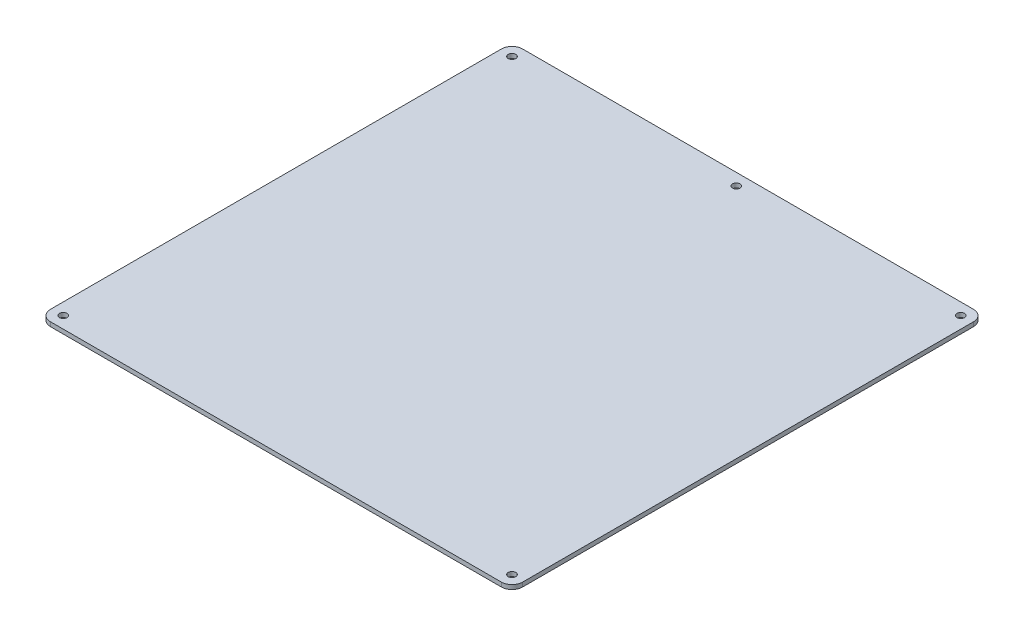
ISO-10303-21;
HEADER;
FILE_DESCRIPTION(('STEP AP214'),'2;1');
FILE_NAME('part.step','',(''),(''),'','','');
FILE_SCHEMA(('AUTOMOTIVE_DESIGN { 1 0 10303 214 1 1 1 1 }'));
ENDSEC;
DATA;
#1=APPLICATION_CONTEXT('core data for automotive mechanical design processes');
#2=APPLICATION_PROTOCOL_DEFINITION('international standard','automotive_design',2000,#1);
#3=PRODUCT_CONTEXT('',#1,'mechanical');
#4=PRODUCT('Part','Part','',(#3));
#5=PRODUCT_RELATED_PRODUCT_CATEGORY('part','',(#4));
#6=PRODUCT_DEFINITION_FORMATION('','',#4);
#7=PRODUCT_DEFINITION_CONTEXT('part definition',#1,'design');
#8=PRODUCT_DEFINITION('design','',#6,#7);
#9=PRODUCT_DEFINITION_SHAPE('','',#8);
#10=(LENGTH_UNIT() NAMED_UNIT(*) SI_UNIT(.MILLI.,.METRE.));
#11=(NAMED_UNIT(*) PLANE_ANGLE_UNIT() SI_UNIT($,.RADIAN.));
#12=(NAMED_UNIT(*) SI_UNIT($,.STERADIAN.) SOLID_ANGLE_UNIT());
#13=UNCERTAINTY_MEASURE_WITH_UNIT(LENGTH_MEASURE(1.E-05),#10,'distance_accuracy_value','');
#14=(GEOMETRIC_REPRESENTATION_CONTEXT(3) GLOBAL_UNCERTAINTY_ASSIGNED_CONTEXT((#13)) GLOBAL_UNIT_ASSIGNED_CONTEXT((#10,
#11,#12)) REPRESENTATION_CONTEXT('',''));
#15=CARTESIAN_POINT('',(0.,0.,0.));
#16=DIRECTION('',(0.,0.,1.));
#17=DIRECTION('',(1.,0.,0.));
#18=AXIS2_PLACEMENT_3D('',#15,#16,#17);
#19=CARTESIAN_POINT('',(-105.,2.,105.));
#20=DIRECTION('',(0.,1.,0.));
#21=DIRECTION('',(0.,0.,1.));
#22=AXIS2_PLACEMENT_3D('',#19,#20,#21);
#23=PLANE('',#22);
#24=CARTESIAN_POINT('',(-104.5,2.,-104.5));
#25=DIRECTION('',(0.,1.,0.));
#26=DIRECTION('',(0.,0.,1.));
#27=AXIS2_PLACEMENT_3D('',#24,#25,#26);
#28=CIRCLE('',#27,1.75);
#29=CARTESIAN_POINT('',(-104.5,2.,-102.75));
#30=VERTEX_POINT('',#29);
#31=EDGE_CURVE('E194',#30,#30,#28,.T.);
#32=ORIENTED_EDGE('',*,*,#31,.F.);
#33=EDGE_LOOP('',(#32));
#34=FACE_BOUND('',#33,.T.);
#35=CARTESIAN_POINT('',(104.5,2.,104.5));
#36=DIRECTION('',(0.,1.,0.));
#37=DIRECTION('',(0.,0.,1.));
#38=AXIS2_PLACEMENT_3D('',#35,#36,#37);
#39=CIRCLE('',#38,1.75);
#40=CARTESIAN_POINT('',(104.5,2.,106.25));
#41=VERTEX_POINT('',#40);
#42=EDGE_CURVE('E182',#41,#41,#39,.T.);
#43=ORIENTED_EDGE('',*,*,#42,.F.);
#44=EDGE_LOOP('',(#43));
#45=FACE_BOUND('',#44,.T.);
#46=CARTESIAN_POINT('',(-105.,2.,105.));
#47=DIRECTION('',(0.,1.,0.));
#48=DIRECTION('',(0.,0.,1.));
#49=AXIS2_PLACEMENT_3D('',#46,#47,#48);
#50=CIRCLE('',#49,5.);
#51=CARTESIAN_POINT('',(-110.,2.,105.));
#52=VERTEX_POINT('',#51);
#53=CARTESIAN_POINT('',(-105.,2.,110.));
#54=VERTEX_POINT('',#53);
#55=EDGE_CURVE('E145',#52,#54,#50,.T.);
#56=ORIENTED_EDGE('',*,*,#55,.T.);
#57=DIRECTION('',(1.,0.,0.));
#58=VECTOR('',#57,1.);
#59=CARTESIAN_POINT('',(-105.,2.,110.));
#60=LINE('',#59,#58);
#61=CARTESIAN_POINT('',(105.,2.,110.));
#62=VERTEX_POINT('',#61);
#63=EDGE_CURVE('E93',#54,#62,#60,.T.);
#64=ORIENTED_EDGE('',*,*,#63,.T.);
#65=CARTESIAN_POINT('',(105.,2.,105.));
#66=DIRECTION('',(0.,1.,0.));
#67=DIRECTION('',(0.,0.,1.));
#68=AXIS2_PLACEMENT_3D('',#65,#66,#67);
#69=CIRCLE('',#68,5.);
#70=CARTESIAN_POINT('',(110.,2.,105.));
#71=VERTEX_POINT('',#70);
#72=EDGE_CURVE('E160',#62,#71,#69,.T.);
#73=ORIENTED_EDGE('',*,*,#72,.T.);
#74=DIRECTION('',(0.,0.,-1.));
#75=VECTOR('',#74,1.);
#76=CARTESIAN_POINT('',(110.,2.,-105.));
#77=LINE('',#76,#75);
#78=CARTESIAN_POINT('',(110.,2.,-105.));
#79=VERTEX_POINT('',#78);
#80=EDGE_CURVE('E173',#71,#79,#77,.T.);
#81=ORIENTED_EDGE('',*,*,#80,.T.);
#82=CARTESIAN_POINT('',(105.,2.,-105.));
#83=DIRECTION('',(0.,1.,0.));
#84=DIRECTION('',(0.,0.,-1.));
#85=AXIS2_PLACEMENT_3D('',#82,#83,#84);
#86=CIRCLE('',#85,5.);
#87=CARTESIAN_POINT('',(105.,2.,-110.));
#88=VERTEX_POINT('',#87);
#89=EDGE_CURVE('E112',#79,#88,#86,.T.);
#90=ORIENTED_EDGE('',*,*,#89,.T.);
#91=DIRECTION('',(-1.,0.,0.));
#92=VECTOR('',#91,1.);
#93=CARTESIAN_POINT('',(-105.,2.,-110.));
#94=LINE('',#93,#92);
#95=CARTESIAN_POINT('',(-105.,2.,-110.));
#96=VERTEX_POINT('',#95);
#97=EDGE_CURVE('E106',#88,#96,#94,.T.);
#98=ORIENTED_EDGE('',*,*,#97,.T.);
#99=CARTESIAN_POINT('',(-105.,2.,-105.));
#100=DIRECTION('',(0.,1.,0.));
#101=DIRECTION('',(0.,0.,-1.));
#102=AXIS2_PLACEMENT_3D('',#99,#100,#101);
#103=CIRCLE('',#102,5.);
#104=CARTESIAN_POINT('',(-110.,2.,-105.));
#105=VERTEX_POINT('',#104);
#106=EDGE_CURVE('E110',#96,#105,#103,.T.);
#107=ORIENTED_EDGE('',*,*,#106,.T.);
#108=DIRECTION('',(0.,0.,1.));
#109=VECTOR('',#108,1.);
#110=CARTESIAN_POINT('',(-110.,2.,-105.));
#111=LINE('',#110,#109);
#112=EDGE_CURVE('E50',#105,#52,#111,.T.);
#113=ORIENTED_EDGE('',*,*,#112,.T.);
#114=EDGE_LOOP('',(#56,#64,#73,#81,#90,#98,#107,#113));
#115=FACE_BOUND('',#114,.T.);
#116=CARTESIAN_POINT('',(104.5,2.,-104.5));
#117=DIRECTION('',(0.,1.,0.));
#118=DIRECTION('',(0.,0.,1.));
#119=AXIS2_PLACEMENT_3D('',#116,#117,#118);
#120=CIRCLE('',#119,1.75);
#121=CARTESIAN_POINT('',(104.5,2.,-102.75));
#122=VERTEX_POINT('',#121);
#123=EDGE_CURVE('E134',#122,#122,#120,.T.);
#124=ORIENTED_EDGE('',*,*,#123,.F.);
#125=EDGE_LOOP('',(#124));
#126=FACE_BOUND('',#125,.T.);
#127=CARTESIAN_POINT('',(0.,2.,-104.5));
#128=DIRECTION('',(0.,1.,0.));
#129=DIRECTION('',(0.,0.,1.));
#130=AXIS2_PLACEMENT_3D('',#127,#128,#129);
#131=CIRCLE('',#130,1.75);
#132=CARTESIAN_POINT('',(0.,2.,-102.75));
#133=VERTEX_POINT('',#132);
#134=EDGE_CURVE('E188',#133,#133,#131,.T.);
#135=ORIENTED_EDGE('',*,*,#134,.F.);
#136=EDGE_LOOP('',(#135));
#137=FACE_BOUND('',#136,.T.);
#138=CARTESIAN_POINT('',(-104.5,2.,104.5));
#139=DIRECTION('',(0.,1.,0.));
#140=DIRECTION('',(0.,0.,1.));
#141=AXIS2_PLACEMENT_3D('',#138,#139,#140);
#142=CIRCLE('',#141,1.75);
#143=CARTESIAN_POINT('',(-104.5,2.,106.25));
#144=VERTEX_POINT('',#143);
#145=EDGE_CURVE('E200',#144,#144,#142,.T.);
#146=ORIENTED_EDGE('',*,*,#145,.F.);
#147=EDGE_LOOP('',(#146));
#148=FACE_BOUND('',#147,.T.);
#149=ADVANCED_FACE('F33',(#34,#45,#115,#126,#137,#148),#23,.T.);
#150=CARTESIAN_POINT('',(-105.,0.,105.));
#151=DIRECTION('',(0.,1.,0.));
#152=DIRECTION('',(0.,0.,1.));
#153=AXIS2_PLACEMENT_3D('',#150,#151,#152);
#154=PLANE('',#153);
#155=CARTESIAN_POINT('',(-105.,0.,105.));
#156=DIRECTION('',(0.,1.,0.));
#157=DIRECTION('',(0.,0.,1.));
#158=AXIS2_PLACEMENT_3D('',#155,#156,#157);
#159=CIRCLE('',#158,5.);
#160=CARTESIAN_POINT('',(-110.,0.,105.));
#161=VERTEX_POINT('',#160);
#162=CARTESIAN_POINT('',(-105.,0.,110.));
#163=VERTEX_POINT('',#162);
#164=EDGE_CURVE('E130',#161,#163,#159,.T.);
#165=ORIENTED_EDGE('',*,*,#164,.F.);
#166=DIRECTION('',(0.,0.,1.));
#167=VECTOR('',#166,1.);
#168=CARTESIAN_POINT('',(-110.,0.,-105.));
#169=LINE('',#168,#167);
#170=CARTESIAN_POINT('',(-110.,0.,-105.));
#171=VERTEX_POINT('',#170);
#172=EDGE_CURVE('E85',#171,#161,#169,.T.);
#173=ORIENTED_EDGE('',*,*,#172,.F.);
#174=CARTESIAN_POINT('',(-105.,0.,-105.));
#175=DIRECTION('',(0.,1.,0.));
#176=DIRECTION('',(0.,0.,-1.));
#177=AXIS2_PLACEMENT_3D('',#174,#175,#176);
#178=CIRCLE('',#177,5.);
#179=CARTESIAN_POINT('',(-105.,0.,-110.));
#180=VERTEX_POINT('',#179);
#181=EDGE_CURVE('E79',#180,#171,#178,.T.);
#182=ORIENTED_EDGE('',*,*,#181,.F.);
#183=DIRECTION('',(-1.,0.,0.));
#184=VECTOR('',#183,1.);
#185=CARTESIAN_POINT('',(-105.,0.,-110.));
#186=LINE('',#185,#184);
#187=CARTESIAN_POINT('',(105.,0.,-110.));
#188=VERTEX_POINT('',#187);
#189=EDGE_CURVE('E120',#188,#180,#186,.T.);
#190=ORIENTED_EDGE('',*,*,#189,.F.);
#191=CARTESIAN_POINT('',(105.,0.,-105.));
#192=DIRECTION('',(0.,1.,0.));
#193=DIRECTION('',(0.,0.,-1.));
#194=AXIS2_PLACEMENT_3D('',#191,#192,#193);
#195=CIRCLE('',#194,5.);
#196=CARTESIAN_POINT('',(110.,0.,-105.));
#197=VERTEX_POINT('',#196);
#198=EDGE_CURVE('E140',#197,#188,#195,.T.);
#199=ORIENTED_EDGE('',*,*,#198,.F.);
#200=DIRECTION('',(0.,0.,-1.));
#201=VECTOR('',#200,1.);
#202=CARTESIAN_POINT('',(110.,0.,-105.));
#203=LINE('',#202,#201);
#204=CARTESIAN_POINT('',(110.,0.,105.));
#205=VERTEX_POINT('',#204);
#206=EDGE_CURVE('E138',#205,#197,#203,.T.);
#207=ORIENTED_EDGE('',*,*,#206,.F.);
#208=CARTESIAN_POINT('',(105.,0.,105.));
#209=DIRECTION('',(0.,1.,0.));
#210=DIRECTION('',(0.,0.,1.));
#211=AXIS2_PLACEMENT_3D('',#208,#209,#210);
#212=CIRCLE('',#211,5.);
#213=CARTESIAN_POINT('',(105.,0.,110.));
#214=VERTEX_POINT('',#213);
#215=EDGE_CURVE('E136',#214,#205,#212,.T.);
#216=ORIENTED_EDGE('',*,*,#215,.F.);
#217=DIRECTION('',(1.,0.,0.));
#218=VECTOR('',#217,1.);
#219=CARTESIAN_POINT('',(-105.,0.,110.));
#220=LINE('',#219,#218);
#221=EDGE_CURVE('E133',#163,#214,#220,.T.);
#222=ORIENTED_EDGE('',*,*,#221,.F.);
#223=EDGE_LOOP('',(#165,#173,#182,#190,#199,#207,#216,#222));
#224=FACE_BOUND('',#223,.T.);
#225=CARTESIAN_POINT('',(104.5,0.,-104.5));
#226=DIRECTION('',(0.,1.,0.));
#227=DIRECTION('',(0.,0.,1.));
#228=AXIS2_PLACEMENT_3D('',#225,#226,#227);
#229=CIRCLE('',#228,1.75);
#230=CARTESIAN_POINT('',(104.5,0.,-102.75));
#231=VERTEX_POINT('',#230);
#232=EDGE_CURVE('E179',#231,#231,#229,.T.);
#233=ORIENTED_EDGE('',*,*,#232,.T.);
#234=EDGE_LOOP('',(#233));
#235=FACE_BOUND('',#234,.T.);
#236=CARTESIAN_POINT('',(104.5,0.,104.5));
#237=DIRECTION('',(0.,1.,0.));
#238=DIRECTION('',(0.,0.,1.));
#239=AXIS2_PLACEMENT_3D('',#236,#237,#238);
#240=CIRCLE('',#239,1.75);
#241=CARTESIAN_POINT('',(104.5,0.,106.25));
#242=VERTEX_POINT('',#241);
#243=EDGE_CURVE('E185',#242,#242,#240,.T.);
#244=ORIENTED_EDGE('',*,*,#243,.T.);
#245=EDGE_LOOP('',(#244));
#246=FACE_BOUND('',#245,.T.);
#247=CARTESIAN_POINT('',(0.,0.,-104.5));
#248=DIRECTION('',(0.,1.,0.));
#249=DIRECTION('',(0.,0.,1.));
#250=AXIS2_PLACEMENT_3D('',#247,#248,#249);
#251=CIRCLE('',#250,1.75);
#252=CARTESIAN_POINT('',(0.,0.,-102.75));
#253=VERTEX_POINT('',#252);
#254=EDGE_CURVE('E191',#253,#253,#251,.T.);
#255=ORIENTED_EDGE('',*,*,#254,.T.);
#256=EDGE_LOOP('',(#255));
#257=FACE_BOUND('',#256,.T.);
#258=CARTESIAN_POINT('',(-104.5,0.,-104.5));
#259=DIRECTION('',(0.,1.,0.));
#260=DIRECTION('',(0.,0.,1.));
#261=AXIS2_PLACEMENT_3D('',#258,#259,#260);
#262=CIRCLE('',#261,1.75);
#263=CARTESIAN_POINT('',(-104.5,0.,-102.75));
#264=VERTEX_POINT('',#263);
#265=EDGE_CURVE('E197',#264,#264,#262,.T.);
#266=ORIENTED_EDGE('',*,*,#265,.T.);
#267=EDGE_LOOP('',(#266));
#268=FACE_BOUND('',#267,.T.);
#269=CARTESIAN_POINT('',(-104.5,0.,104.5));
#270=DIRECTION('',(0.,1.,0.));
#271=DIRECTION('',(0.,0.,1.));
#272=AXIS2_PLACEMENT_3D('',#269,#270,#271);
#273=CIRCLE('',#272,1.75);
#274=CARTESIAN_POINT('',(-104.5,0.,106.25));
#275=VERTEX_POINT('',#274);
#276=EDGE_CURVE('E203',#275,#275,#273,.T.);
#277=ORIENTED_EDGE('',*,*,#276,.T.);
#278=EDGE_LOOP('',(#277));
#279=FACE_BOUND('',#278,.T.);
#280=ADVANCED_FACE('F164',(#224,#235,#246,#257,#268,#279),#154,.F.);
#281=CARTESIAN_POINT('',(-105.,2.,105.));
#282=DIRECTION('',(0.,-1.,0.));
#283=DIRECTION('',(0.,0.,-1.));
#284=AXIS2_PLACEMENT_3D('',#281,#282,#283);
#285=CYLINDRICAL_SURFACE('',#284,5.);
#286=ORIENTED_EDGE('',*,*,#164,.T.);
#287=DIRECTION('',(0.,-1.,0.));
#288=VECTOR('',#287,1.);
#289=CARTESIAN_POINT('',(-105.,2.,110.));
#290=LINE('',#289,#288);
#291=EDGE_CURVE('E11',#54,#163,#290,.T.);
#292=ORIENTED_EDGE('',*,*,#291,.F.);
#293=ORIENTED_EDGE('',*,*,#55,.F.);
#294=DIRECTION('',(0.,-1.,0.));
#295=VECTOR('',#294,1.);
#296=CARTESIAN_POINT('',(-110.,2.,105.));
#297=LINE('',#296,#295);
#298=EDGE_CURVE('E126',#52,#161,#297,.T.);
#299=ORIENTED_EDGE('',*,*,#298,.T.);
#300=EDGE_LOOP('',(#286,#292,#293,#299));
#301=FACE_BOUND('',#300,.T.);
#302=ADVANCED_FACE('F35',(#301),#285,.T.);
#303=CARTESIAN_POINT('',(-105.,2.,110.));
#304=DIRECTION('',(0.,0.,-1.));
#305=DIRECTION('',(-1.,0.,0.));
#306=AXIS2_PLACEMENT_3D('',#303,#304,#305);
#307=PLANE('',#306);
#308=ORIENTED_EDGE('',*,*,#221,.T.);
#309=DIRECTION('',(0.,-1.,0.));
#310=VECTOR('',#309,1.);
#311=CARTESIAN_POINT('',(105.,2.,110.));
#312=LINE('',#311,#310);
#313=EDGE_CURVE('E42',#62,#214,#312,.T.);
#314=ORIENTED_EDGE('',*,*,#313,.F.);
#315=ORIENTED_EDGE('',*,*,#63,.F.);
#316=ORIENTED_EDGE('',*,*,#291,.T.);
#317=EDGE_LOOP('',(#308,#314,#315,#316));
#318=FACE_BOUND('',#317,.T.);
#319=ADVANCED_FACE('F237',(#318),#307,.F.);
#320=CARTESIAN_POINT('',(105.,2.,105.));
#321=DIRECTION('',(0.,-1.,0.));
#322=DIRECTION('',(0.,0.,-1.));
#323=AXIS2_PLACEMENT_3D('',#320,#321,#322);
#324=CYLINDRICAL_SURFACE('',#323,5.);
#325=ORIENTED_EDGE('',*,*,#215,.T.);
#326=DIRECTION('',(0.,-1.,0.));
#327=VECTOR('',#326,1.);
#328=CARTESIAN_POINT('',(110.,2.,105.));
#329=LINE('',#328,#327);
#330=EDGE_CURVE('E152',#71,#205,#329,.T.);
#331=ORIENTED_EDGE('',*,*,#330,.F.);
#332=ORIENTED_EDGE('',*,*,#72,.F.);
#333=ORIENTED_EDGE('',*,*,#313,.T.);
#334=EDGE_LOOP('',(#325,#331,#332,#333));
#335=FACE_BOUND('',#334,.T.);
#336=ADVANCED_FACE('F158',(#335),#324,.T.);
#337=CARTESIAN_POINT('',(110.,2.,-105.));
#338=DIRECTION('',(-1.,0.,0.));
#339=DIRECTION('',(0.,0.,1.));
#340=AXIS2_PLACEMENT_3D('',#337,#338,#339);
#341=PLANE('',#340);
#342=ORIENTED_EDGE('',*,*,#206,.T.);
#343=DIRECTION('',(0.,-1.,0.));
#344=VECTOR('',#343,1.);
#345=CARTESIAN_POINT('',(110.,2.,-105.));
#346=LINE('',#345,#344);
#347=EDGE_CURVE('E149',#79,#197,#346,.T.);
#348=ORIENTED_EDGE('',*,*,#347,.F.);
#349=ORIENTED_EDGE('',*,*,#80,.F.);
#350=ORIENTED_EDGE('',*,*,#330,.T.);
#351=EDGE_LOOP('',(#342,#348,#349,#350));
#352=FACE_BOUND('',#351,.T.);
#353=ADVANCED_FACE('F169',(#352),#341,.F.);
#354=CARTESIAN_POINT('',(105.,2.,-105.));
#355=DIRECTION('',(0.,-1.,0.));
#356=DIRECTION('',(0.,0.,-1.));
#357=AXIS2_PLACEMENT_3D('',#354,#355,#356);
#358=CYLINDRICAL_SURFACE('',#357,5.);
#359=ORIENTED_EDGE('',*,*,#198,.T.);
#360=DIRECTION('',(0.,-1.,0.));
#361=VECTOR('',#360,1.);
#362=CARTESIAN_POINT('',(105.,2.,-110.));
#363=LINE('',#362,#361);
#364=EDGE_CURVE('E121',#88,#188,#363,.T.);
#365=ORIENTED_EDGE('',*,*,#364,.F.);
#366=ORIENTED_EDGE('',*,*,#89,.F.);
#367=ORIENTED_EDGE('',*,*,#347,.T.);
#368=EDGE_LOOP('',(#359,#365,#366,#367));
#369=FACE_BOUND('',#368,.T.);
#370=ADVANCED_FACE('F172',(#369),#358,.T.);
#371=CARTESIAN_POINT('',(-105.,2.,-110.));
#372=DIRECTION('',(0.,0.,1.));
#373=DIRECTION('',(1.,0.,0.));
#374=AXIS2_PLACEMENT_3D('',#371,#372,#373);
#375=PLANE('',#374);
#376=ORIENTED_EDGE('',*,*,#189,.T.);
#377=DIRECTION('',(0.,-1.,0.));
#378=VECTOR('',#377,1.);
#379=CARTESIAN_POINT('',(-105.,2.,-110.));
#380=LINE('',#379,#378);
#381=EDGE_CURVE('E117',#96,#180,#380,.T.);
#382=ORIENTED_EDGE('',*,*,#381,.F.);
#383=ORIENTED_EDGE('',*,*,#97,.F.);
#384=ORIENTED_EDGE('',*,*,#364,.T.);
#385=EDGE_LOOP('',(#376,#382,#383,#384));
#386=FACE_BOUND('',#385,.T.);
#387=ADVANCED_FACE('F118',(#386),#375,.F.);
#388=CARTESIAN_POINT('',(-105.,2.,-105.));
#389=DIRECTION('',(0.,-1.,0.));
#390=DIRECTION('',(0.,0.,-1.));
#391=AXIS2_PLACEMENT_3D('',#388,#389,#390);
#392=CYLINDRICAL_SURFACE('',#391,5.);
#393=ORIENTED_EDGE('',*,*,#181,.T.);
#394=DIRECTION('',(0.,-1.,0.));
#395=VECTOR('',#394,1.);
#396=CARTESIAN_POINT('',(-110.,2.,-105.));
#397=LINE('',#396,#395);
#398=EDGE_CURVE('E122',#105,#171,#397,.T.);
#399=ORIENTED_EDGE('',*,*,#398,.F.);
#400=ORIENTED_EDGE('',*,*,#106,.F.);
#401=ORIENTED_EDGE('',*,*,#381,.T.);
#402=EDGE_LOOP('',(#393,#399,#400,#401));
#403=FACE_BOUND('',#402,.T.);
#404=ADVANCED_FACE('F124',(#403),#392,.T.);
#405=CARTESIAN_POINT('',(-110.,2.,-105.));
#406=DIRECTION('',(1.,0.,0.));
#407=DIRECTION('',(0.,0.,-1.));
#408=AXIS2_PLACEMENT_3D('',#405,#406,#407);
#409=PLANE('',#408);
#410=ORIENTED_EDGE('',*,*,#172,.T.);
#411=ORIENTED_EDGE('',*,*,#298,.F.);
#412=ORIENTED_EDGE('',*,*,#112,.F.);
#413=ORIENTED_EDGE('',*,*,#398,.T.);
#414=EDGE_LOOP('',(#410,#411,#412,#413));
#415=FACE_BOUND('',#414,.T.);
#416=ADVANCED_FACE('F225',(#415),#409,.F.);
#417=CARTESIAN_POINT('',(104.5,2.,-104.5));
#418=DIRECTION('',(0.,-1.,0.));
#419=DIRECTION('',(0.,0.,-1.));
#420=AXIS2_PLACEMENT_3D('',#417,#418,#419);
#421=CYLINDRICAL_SURFACE('',#420,1.75);
#422=ORIENTED_EDGE('',*,*,#123,.T.);
#423=EDGE_LOOP('',(#422));
#424=FACE_BOUND('',#423,.T.);
#425=ORIENTED_EDGE('',*,*,#232,.F.);
#426=EDGE_LOOP('',(#425));
#427=FACE_BOUND('',#426,.T.);
#428=ADVANCED_FACE('F222',(#424,#427),#421,.F.);
#429=CARTESIAN_POINT('',(104.5,2.,104.5));
#430=DIRECTION('',(0.,-1.,0.));
#431=DIRECTION('',(0.,0.,-1.));
#432=AXIS2_PLACEMENT_3D('',#429,#430,#431);
#433=CYLINDRICAL_SURFACE('',#432,1.75);
#434=ORIENTED_EDGE('',*,*,#42,.T.);
#435=EDGE_LOOP('',(#434));
#436=FACE_BOUND('',#435,.T.);
#437=ORIENTED_EDGE('',*,*,#243,.F.);
#438=EDGE_LOOP('',(#437));
#439=FACE_BOUND('',#438,.T.);
#440=ADVANCED_FACE('F301',(#436,#439),#433,.F.);
#441=CARTESIAN_POINT('',(0.,2.,-104.5));
#442=DIRECTION('',(0.,-1.,0.));
#443=DIRECTION('',(0.,0.,-1.));
#444=AXIS2_PLACEMENT_3D('',#441,#442,#443);
#445=CYLINDRICAL_SURFACE('',#444,1.75);
#446=ORIENTED_EDGE('',*,*,#134,.T.);
#447=EDGE_LOOP('',(#446));
#448=FACE_BOUND('',#447,.T.);
#449=ORIENTED_EDGE('',*,*,#254,.F.);
#450=EDGE_LOOP('',(#449));
#451=FACE_BOUND('',#450,.T.);
#452=ADVANCED_FACE('F309',(#448,#451),#445,.F.);
#453=CARTESIAN_POINT('',(-104.5,2.,-104.5));
#454=DIRECTION('',(0.,-1.,0.));
#455=DIRECTION('',(0.,0.,-1.));
#456=AXIS2_PLACEMENT_3D('',#453,#454,#455);
#457=CYLINDRICAL_SURFACE('',#456,1.75);
#458=ORIENTED_EDGE('',*,*,#31,.T.);
#459=EDGE_LOOP('',(#458));
#460=FACE_BOUND('',#459,.T.);
#461=ORIENTED_EDGE('',*,*,#265,.F.);
#462=EDGE_LOOP('',(#461));
#463=FACE_BOUND('',#462,.T.);
#464=ADVANCED_FACE('F317',(#460,#463),#457,.F.);
#465=CARTESIAN_POINT('',(-104.5,2.,104.5));
#466=DIRECTION('',(0.,-1.,0.));
#467=DIRECTION('',(0.,0.,-1.));
#468=AXIS2_PLACEMENT_3D('',#465,#466,#467);
#469=CYLINDRICAL_SURFACE('',#468,1.75);
#470=ORIENTED_EDGE('',*,*,#145,.T.);
#471=EDGE_LOOP('',(#470));
#472=FACE_BOUND('',#471,.T.);
#473=ORIENTED_EDGE('',*,*,#276,.F.);
#474=EDGE_LOOP('',(#473));
#475=FACE_BOUND('',#474,.T.);
#476=ADVANCED_FACE('F209',(#472,#475),#469,.F.);
#477=CLOSED_SHELL('',(#149,#280,#302,#319,#336,#353,#370,#387,#404,#416,#428,#440,#452,#464,#476));
#478=MANIFOLD_SOLID_BREP('B2',#477);
#479=ADVANCED_BREP_SHAPE_REPRESENTATION('',(#18,#478),#14);
#480=SHAPE_DEFINITION_REPRESENTATION(#9,#479);
ENDSEC;
END-ISO-10303-21;
